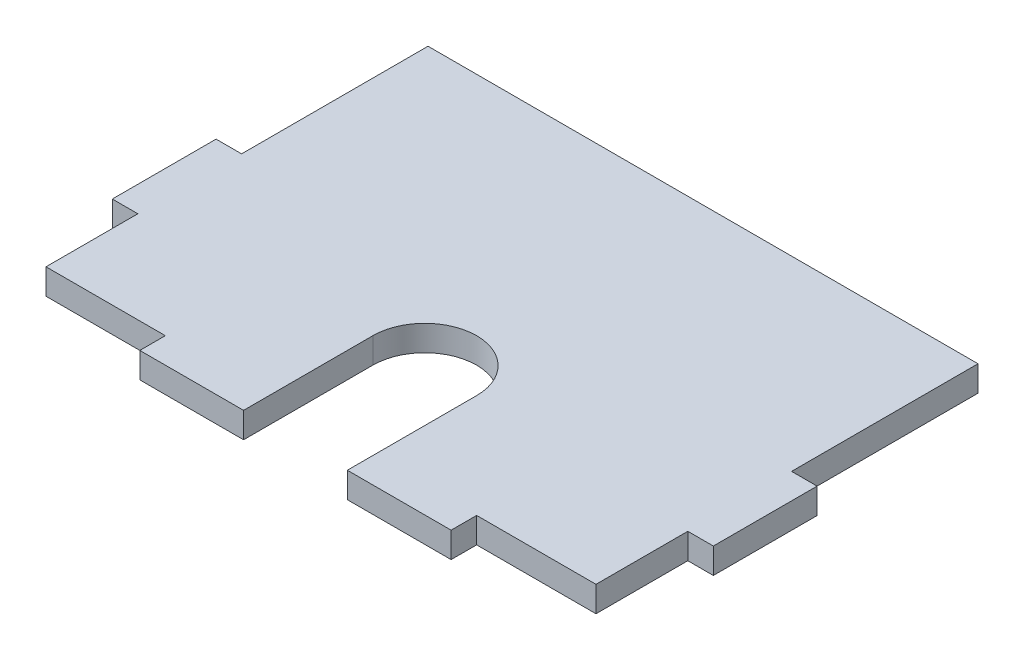
ISO-10303-21;
HEADER;
FILE_DESCRIPTION(('STEP AP214'),'2;1');
FILE_NAME('part.step','',(''),(''),'','','');
FILE_SCHEMA(('AUTOMOTIVE_DESIGN { 1 0 10303 214 1 1 1 1 }'));
ENDSEC;
DATA;
#1=APPLICATION_CONTEXT('core data for automotive mechanical design processes');
#2=APPLICATION_PROTOCOL_DEFINITION('international standard','automotive_design',2000,#1);
#3=PRODUCT_CONTEXT('',#1,'mechanical');
#4=PRODUCT('Part','Part','',(#3));
#5=PRODUCT_RELATED_PRODUCT_CATEGORY('part','',(#4));
#6=PRODUCT_DEFINITION_FORMATION('','',#4);
#7=PRODUCT_DEFINITION_CONTEXT('part definition',#1,'design');
#8=PRODUCT_DEFINITION('design','',#6,#7);
#9=PRODUCT_DEFINITION_SHAPE('','',#8);
#10=(LENGTH_UNIT() NAMED_UNIT(*) SI_UNIT(.MILLI.,.METRE.));
#11=(NAMED_UNIT(*) PLANE_ANGLE_UNIT() SI_UNIT($,.RADIAN.));
#12=(NAMED_UNIT(*) SI_UNIT($,.STERADIAN.) SOLID_ANGLE_UNIT());
#13=UNCERTAINTY_MEASURE_WITH_UNIT(LENGTH_MEASURE(1.E-05),#10,'distance_accuracy_value','');
#14=(GEOMETRIC_REPRESENTATION_CONTEXT(3) GLOBAL_UNCERTAINTY_ASSIGNED_CONTEXT((#13)) GLOBAL_UNIT_ASSIGNED_CONTEXT((#10,
#11,#12)) REPRESENTATION_CONTEXT('',''));
#15=CARTESIAN_POINT('',(0.,0.,0.));
#16=DIRECTION('',(0.,0.,1.));
#17=DIRECTION('',(1.,0.,0.));
#18=AXIS2_PLACEMENT_3D('',#15,#16,#17);
#19=CARTESIAN_POINT('',(133.35,3.1242,37.338));
#20=DIRECTION('',(0.,-1.,0.));
#21=DIRECTION('',(0.,0.,-1.));
#22=AXIS2_PLACEMENT_3D('',#19,#20,#21);
#23=CYLINDRICAL_SURFACE('',#22,6.34999999999997);
#24=CARTESIAN_POINT('',(133.35,0.,37.338));
#25=DIRECTION('',(0.,-1.,0.));
#26=DIRECTION('',(0.,0.,1.));
#27=AXIS2_PLACEMENT_3D('',#24,#25,#26);
#28=CIRCLE('',#27,6.34999999999997);
#29=CARTESIAN_POINT('',(127.,0.,37.338));
#30=VERTEX_POINT('',#29);
#31=CARTESIAN_POINT('',(139.7,0.,37.338));
#32=VERTEX_POINT('',#31);
#33=EDGE_CURVE('E205',#30,#32,#28,.T.);
#34=ORIENTED_EDGE('',*,*,#33,.T.);
#35=DIRECTION('',(0.,-1.,0.));
#36=VECTOR('',#35,1.);
#37=CARTESIAN_POINT('',(139.7,3.1242,37.338));
#38=LINE('',#37,#36);
#39=CARTESIAN_POINT('',(139.7,3.1242,37.338));
#40=VERTEX_POINT('',#39);
#41=EDGE_CURVE('E41',#40,#32,#38,.T.);
#42=ORIENTED_EDGE('',*,*,#41,.F.);
#43=CARTESIAN_POINT('',(133.35,3.1242,37.338));
#44=DIRECTION('',(0.,-1.,0.));
#45=DIRECTION('',(0.,0.,1.));
#46=AXIS2_PLACEMENT_3D('',#43,#44,#45);
#47=CIRCLE('',#46,6.34999999999997);
#48=CARTESIAN_POINT('',(127.,3.1242,37.338));
#49=VERTEX_POINT('',#48);
#50=EDGE_CURVE('E129',#49,#40,#47,.T.);
#51=ORIENTED_EDGE('',*,*,#50,.F.);
#52=DIRECTION('',(0.,-1.,0.));
#53=VECTOR('',#52,1.);
#54=CARTESIAN_POINT('',(127.,3.1242,37.338));
#55=LINE('',#54,#53);
#56=EDGE_CURVE('E11',#49,#30,#55,.T.);
#57=ORIENTED_EDGE('',*,*,#56,.T.);
#58=EDGE_LOOP('',(#34,#42,#51,#57));
#59=FACE_BOUND('',#58,.T.);
#60=ADVANCED_FACE('F33',(#59),#23,.F.);
#61=CARTESIAN_POINT('',(139.7,3.1242,50.038));
#62=DIRECTION('',(1.,0.,0.));
#63=DIRECTION('',(0.,0.,-1.));
#64=AXIS2_PLACEMENT_3D('',#61,#62,#63);
#65=PLANE('',#64);
#66=DIRECTION('',(0.,0.,1.));
#67=VECTOR('',#66,1.);
#68=CARTESIAN_POINT('',(139.7,0.,50.038));
#69=LINE('',#68,#67);
#70=CARTESIAN_POINT('',(139.7,0.,53.1622));
#71=VERTEX_POINT('',#70);
#72=EDGE_CURVE('E208',#32,#71,#69,.T.);
#73=ORIENTED_EDGE('',*,*,#72,.T.);
#74=DIRECTION('',(0.,-1.,0.));
#75=VECTOR('',#74,1.);
#76=CARTESIAN_POINT('',(139.7,3.1242,53.1622));
#77=LINE('',#76,#75);
#78=CARTESIAN_POINT('',(139.7,3.1242,53.1622));
#79=VERTEX_POINT('',#78);
#80=EDGE_CURVE('E285',#79,#71,#77,.T.);
#81=ORIENTED_EDGE('',*,*,#80,.F.);
#82=DIRECTION('',(0.,0.,1.));
#83=VECTOR('',#82,1.);
#84=CARTESIAN_POINT('',(139.7,3.1242,37.338));
#85=LINE('',#84,#83);
#86=EDGE_CURVE('E292',#40,#79,#85,.T.);
#87=ORIENTED_EDGE('',*,*,#86,.F.);
#88=ORIENTED_EDGE('',*,*,#41,.T.);
#89=EDGE_LOOP('',(#73,#81,#87,#88));
#90=FACE_BOUND('',#89,.T.);
#91=ADVANCED_FACE('F290',(#90),#65,.F.);
#92=CARTESIAN_POINT('',(139.7,3.1242,53.1622));
#93=DIRECTION('',(0.,0.,-1.));
#94=DIRECTION('',(-1.,0.,0.));
#95=AXIS2_PLACEMENT_3D('',#92,#93,#94);
#96=PLANE('',#95);
#97=DIRECTION('',(1.,0.,0.));
#98=VECTOR('',#97,1.);
#99=CARTESIAN_POINT('',(139.7,0.,53.1622));
#100=LINE('',#99,#98);
#101=CARTESIAN_POINT('',(152.4,0.,53.1622));
#102=VERTEX_POINT('',#101);
#103=EDGE_CURVE('E210',#71,#102,#100,.T.);
#104=ORIENTED_EDGE('',*,*,#103,.T.);
#105=DIRECTION('',(0.,-1.,0.));
#106=VECTOR('',#105,1.);
#107=CARTESIAN_POINT('',(152.4,3.1242,53.1622));
#108=LINE('',#107,#106);
#109=CARTESIAN_POINT('',(152.4,3.1242,53.1622));
#110=VERTEX_POINT('',#109);
#111=EDGE_CURVE('E282',#110,#102,#108,.T.);
#112=ORIENTED_EDGE('',*,*,#111,.F.);
#113=DIRECTION('',(1.,0.,0.));
#114=VECTOR('',#113,1.);
#115=CARTESIAN_POINT('',(139.7,3.1242,53.1622));
#116=LINE('',#115,#114);
#117=EDGE_CURVE('E311',#79,#110,#116,.T.);
#118=ORIENTED_EDGE('',*,*,#117,.F.);
#119=ORIENTED_EDGE('',*,*,#80,.T.);
#120=EDGE_LOOP('',(#104,#112,#118,#119));
#121=FACE_BOUND('',#120,.T.);
#122=ADVANCED_FACE('F302',(#121),#96,.F.);
#123=CARTESIAN_POINT('',(152.4,3.1242,53.1622));
#124=DIRECTION('',(-1.,0.,0.));
#125=DIRECTION('',(0.,0.,1.));
#126=AXIS2_PLACEMENT_3D('',#123,#124,#125);
#127=PLANE('',#126);
#128=DIRECTION('',(0.,0.,-1.));
#129=VECTOR('',#128,1.);
#130=CARTESIAN_POINT('',(152.4,0.,53.1622));
#131=LINE('',#130,#129);
#132=CARTESIAN_POINT('',(152.4,0.,50.038));
#133=VERTEX_POINT('',#132);
#134=EDGE_CURVE('E212',#102,#133,#131,.T.);
#135=ORIENTED_EDGE('',*,*,#134,.T.);
#136=DIRECTION('',(0.,-1.,0.));
#137=VECTOR('',#136,1.);
#138=CARTESIAN_POINT('',(152.4,3.1242,50.038));
#139=LINE('',#138,#137);
#140=CARTESIAN_POINT('',(152.4,3.1242,50.038));
#141=VERTEX_POINT('',#140);
#142=EDGE_CURVE('E279',#141,#133,#139,.T.);
#143=ORIENTED_EDGE('',*,*,#142,.F.);
#144=DIRECTION('',(0.,0.,-1.));
#145=VECTOR('',#144,1.);
#146=CARTESIAN_POINT('',(152.4,3.1242,53.1622));
#147=LINE('',#146,#145);
#148=EDGE_CURVE('E308',#110,#141,#147,.T.);
#149=ORIENTED_EDGE('',*,*,#148,.F.);
#150=ORIENTED_EDGE('',*,*,#111,.T.);
#151=EDGE_LOOP('',(#135,#143,#149,#150));
#152=FACE_BOUND('',#151,.T.);
#153=ADVANCED_FACE('F306',(#152),#127,.F.);
#154=CARTESIAN_POINT('',(152.4,3.1242,50.038));
#155=DIRECTION('',(0.,0.,-1.));
#156=DIRECTION('',(-1.,0.,0.));
#157=AXIS2_PLACEMENT_3D('',#154,#155,#156);
#158=PLANE('',#157);
#159=DIRECTION('',(1.,0.,0.));
#160=VECTOR('',#159,1.);
#161=CARTESIAN_POINT('',(152.4,0.,50.038));
#162=LINE('',#161,#160);
#163=CARTESIAN_POINT('',(167.005,0.,50.038));
#164=VERTEX_POINT('',#163);
#165=EDGE_CURVE('E214',#133,#164,#162,.T.);
#166=ORIENTED_EDGE('',*,*,#165,.T.);
#167=DIRECTION('',(0.,-1.,0.));
#168=VECTOR('',#167,1.);
#169=CARTESIAN_POINT('',(167.005,3.1242,50.038));
#170=LINE('',#169,#168);
#171=CARTESIAN_POINT('',(167.005,3.1242,50.038));
#172=VERTEX_POINT('',#171);
#173=EDGE_CURVE('E276',#172,#164,#170,.T.);
#174=ORIENTED_EDGE('',*,*,#173,.F.);
#175=DIRECTION('',(1.,0.,0.));
#176=VECTOR('',#175,1.);
#177=CARTESIAN_POINT('',(152.4,3.1242,50.038));
#178=LINE('',#177,#176);
#179=EDGE_CURVE('E310',#141,#172,#178,.T.);
#180=ORIENTED_EDGE('',*,*,#179,.F.);
#181=ORIENTED_EDGE('',*,*,#142,.T.);
#182=EDGE_LOOP('',(#166,#174,#180,#181));
#183=FACE_BOUND('',#182,.T.);
#184=ADVANCED_FACE('F391',(#183),#158,.F.);
#185=CARTESIAN_POINT('',(167.005,3.1242,50.038));
#186=DIRECTION('',(-1.,0.,0.));
#187=DIRECTION('',(0.,0.,1.));
#188=AXIS2_PLACEMENT_3D('',#185,#186,#187);
#189=PLANE('',#188);
#190=DIRECTION('',(0.,0.,-1.));
#191=VECTOR('',#190,1.);
#192=CARTESIAN_POINT('',(167.005,0.,50.038));
#193=LINE('',#192,#191);
#194=CARTESIAN_POINT('',(167.005,0.,38.7985));
#195=VERTEX_POINT('',#194);
#196=EDGE_CURVE('E216',#164,#195,#193,.T.);
#197=ORIENTED_EDGE('',*,*,#196,.T.);
#198=DIRECTION('',(0.,-1.,0.));
#199=VECTOR('',#198,1.);
#200=CARTESIAN_POINT('',(167.005,3.1242,38.7985));
#201=LINE('',#200,#199);
#202=CARTESIAN_POINT('',(167.005,3.1242,38.7985));
#203=VERTEX_POINT('',#202);
#204=EDGE_CURVE('E273',#203,#195,#201,.T.);
#205=ORIENTED_EDGE('',*,*,#204,.F.);
#206=DIRECTION('',(0.,0.,-1.));
#207=VECTOR('',#206,1.);
#208=CARTESIAN_POINT('',(167.005,3.1242,50.038));
#209=LINE('',#208,#207);
#210=EDGE_CURVE('E313',#172,#203,#209,.T.);
#211=ORIENTED_EDGE('',*,*,#210,.F.);
#212=ORIENTED_EDGE('',*,*,#173,.T.);
#213=EDGE_LOOP('',(#197,#205,#211,#212));
#214=FACE_BOUND('',#213,.T.);
#215=ADVANCED_FACE('F388',(#214),#189,.F.);
#216=CARTESIAN_POINT('',(167.005,3.1242,38.7985));
#217=DIRECTION('',(0.,0.,-1.));
#218=DIRECTION('',(-1.,0.,0.));
#219=AXIS2_PLACEMENT_3D('',#216,#217,#218);
#220=PLANE('',#219);
#221=DIRECTION('',(1.,0.,0.));
#222=VECTOR('',#221,1.);
#223=CARTESIAN_POINT('',(167.005,0.,38.7985));
#224=LINE('',#223,#222);
#225=CARTESIAN_POINT('',(170.1292,0.,38.7985));
#226=VERTEX_POINT('',#225);
#227=EDGE_CURVE('E218',#195,#226,#224,.T.);
#228=ORIENTED_EDGE('',*,*,#227,.T.);
#229=DIRECTION('',(0.,-1.,0.));
#230=VECTOR('',#229,1.);
#231=CARTESIAN_POINT('',(170.1292,3.1242,38.7985));
#232=LINE('',#231,#230);
#233=CARTESIAN_POINT('',(170.1292,3.1242,38.7985));
#234=VERTEX_POINT('',#233);
#235=EDGE_CURVE('E270',#234,#226,#232,.T.);
#236=ORIENTED_EDGE('',*,*,#235,.F.);
#237=DIRECTION('',(1.,0.,0.));
#238=VECTOR('',#237,1.);
#239=CARTESIAN_POINT('',(167.005,3.1242,38.7985));
#240=LINE('',#239,#238);
#241=EDGE_CURVE('E319',#203,#234,#240,.T.);
#242=ORIENTED_EDGE('',*,*,#241,.F.);
#243=ORIENTED_EDGE('',*,*,#204,.T.);
#244=EDGE_LOOP('',(#228,#236,#242,#243));
#245=FACE_BOUND('',#244,.T.);
#246=ADVANCED_FACE('F384',(#245),#220,.F.);
#247=CARTESIAN_POINT('',(170.1292,3.1242,38.7985));
#248=DIRECTION('',(-1.,0.,0.));
#249=DIRECTION('',(0.,0.,1.));
#250=AXIS2_PLACEMENT_3D('',#247,#248,#249);
#251=PLANE('',#250);
#252=DIRECTION('',(0.,0.,-1.));
#253=VECTOR('',#252,1.);
#254=CARTESIAN_POINT('',(170.1292,0.,38.7985));
#255=LINE('',#254,#253);
#256=CARTESIAN_POINT('',(170.1292,0.,26.0985));
#257=VERTEX_POINT('',#256);
#258=EDGE_CURVE('E220',#226,#257,#255,.T.);
#259=ORIENTED_EDGE('',*,*,#258,.T.);
#260=DIRECTION('',(0.,-1.,0.));
#261=VECTOR('',#260,1.);
#262=CARTESIAN_POINT('',(170.1292,3.1242,26.0985));
#263=LINE('',#262,#261);
#264=CARTESIAN_POINT('',(170.1292,3.1242,26.0985));
#265=VERTEX_POINT('',#264);
#266=EDGE_CURVE('E267',#265,#257,#263,.T.);
#267=ORIENTED_EDGE('',*,*,#266,.F.);
#268=DIRECTION('',(0.,0.,-1.));
#269=VECTOR('',#268,1.);
#270=CARTESIAN_POINT('',(170.1292,3.1242,38.7985));
#271=LINE('',#270,#269);
#272=EDGE_CURVE('E321',#234,#265,#271,.T.);
#273=ORIENTED_EDGE('',*,*,#272,.F.);
#274=ORIENTED_EDGE('',*,*,#235,.T.);
#275=EDGE_LOOP('',(#259,#267,#273,#274));
#276=FACE_BOUND('',#275,.T.);
#277=ADVANCED_FACE('F379',(#276),#251,.F.);
#278=CARTESIAN_POINT('',(170.1292,3.1242,26.0985));
#279=DIRECTION('',(0.,0.,1.));
#280=DIRECTION('',(1.,0.,0.));
#281=AXIS2_PLACEMENT_3D('',#278,#279,#280);
#282=PLANE('',#281);
#283=DIRECTION('',(-1.,0.,0.));
#284=VECTOR('',#283,1.);
#285=CARTESIAN_POINT('',(170.1292,0.,26.0985));
#286=LINE('',#285,#284);
#287=CARTESIAN_POINT('',(167.005,0.,26.0985));
#288=VERTEX_POINT('',#287);
#289=EDGE_CURVE('E222',#257,#288,#286,.T.);
#290=ORIENTED_EDGE('',*,*,#289,.T.);
#291=DIRECTION('',(0.,-1.,0.));
#292=VECTOR('',#291,1.);
#293=CARTESIAN_POINT('',(167.005,3.1242,26.0985));
#294=LINE('',#293,#292);
#295=CARTESIAN_POINT('',(167.005,3.1242,26.0985));
#296=VERTEX_POINT('',#295);
#297=EDGE_CURVE('E264',#296,#288,#294,.T.);
#298=ORIENTED_EDGE('',*,*,#297,.F.);
#299=DIRECTION('',(-1.,0.,0.));
#300=VECTOR('',#299,1.);
#301=CARTESIAN_POINT('',(170.1292,3.1242,26.0985));
#302=LINE('',#301,#300);
#303=EDGE_CURVE('E323',#265,#296,#302,.T.);
#304=ORIENTED_EDGE('',*,*,#303,.F.);
#305=ORIENTED_EDGE('',*,*,#266,.T.);
#306=EDGE_LOOP('',(#290,#298,#304,#305));
#307=FACE_BOUND('',#306,.T.);
#308=ADVANCED_FACE('F373',(#307),#282,.F.);
#309=CARTESIAN_POINT('',(167.005,3.1242,26.0985));
#310=DIRECTION('',(-1.,0.,0.));
#311=DIRECTION('',(0.,0.,1.));
#312=AXIS2_PLACEMENT_3D('',#309,#310,#311);
#313=PLANE('',#312);
#314=DIRECTION('',(0.,0.,-1.));
#315=VECTOR('',#314,1.);
#316=CARTESIAN_POINT('',(167.005,0.,26.0985));
#317=LINE('',#316,#315);
#318=CARTESIAN_POINT('',(167.005,0.,3.28263708266812));
#319=VERTEX_POINT('',#318);
#320=EDGE_CURVE('E224',#288,#319,#317,.T.);
#321=ORIENTED_EDGE('',*,*,#320,.T.);
#322=DIRECTION('',(0.,-1.,0.));
#323=VECTOR('',#322,1.);
#324=CARTESIAN_POINT('',(167.005,3.1242,3.28263708266812));
#325=LINE('',#324,#323);
#326=CARTESIAN_POINT('',(167.005,3.1242,3.28263708266812));
#327=VERTEX_POINT('',#326);
#328=EDGE_CURVE('E261',#327,#319,#325,.T.);
#329=ORIENTED_EDGE('',*,*,#328,.F.);
#330=DIRECTION('',(0.,0.,-1.));
#331=VECTOR('',#330,1.);
#332=CARTESIAN_POINT('',(167.005,3.1242,26.0985));
#333=LINE('',#332,#331);
#334=EDGE_CURVE('E325',#296,#327,#333,.T.);
#335=ORIENTED_EDGE('',*,*,#334,.F.);
#336=ORIENTED_EDGE('',*,*,#297,.T.);
#337=EDGE_LOOP('',(#321,#329,#335,#336));
#338=FACE_BOUND('',#337,.T.);
#339=ADVANCED_FACE('F369',(#338),#313,.F.);
#340=CARTESIAN_POINT('',(167.005,3.1242,3.28263708266812));
#341=DIRECTION('',(0.,0.,1.));
#342=DIRECTION('',(1.,0.,0.));
#343=AXIS2_PLACEMENT_3D('',#340,#341,#342);
#344=PLANE('',#343);
#345=DIRECTION('',(-1.,0.,0.));
#346=VECTOR('',#345,1.);
#347=CARTESIAN_POINT('',(167.005,0.,3.28263708266812));
#348=LINE('',#347,#346);
#349=CARTESIAN_POINT('',(99.695,0.,3.28263708266813));
#350=VERTEX_POINT('',#349);
#351=EDGE_CURVE('E226',#319,#350,#348,.T.);
#352=ORIENTED_EDGE('',*,*,#351,.T.);
#353=DIRECTION('',(0.,-1.,0.));
#354=VECTOR('',#353,1.);
#355=CARTESIAN_POINT('',(99.695,3.1242,3.28263708266813));
#356=LINE('',#355,#354);
#357=CARTESIAN_POINT('',(99.695,3.1242,3.28263708266813));
#358=VERTEX_POINT('',#357);
#359=EDGE_CURVE('E258',#358,#350,#356,.T.);
#360=ORIENTED_EDGE('',*,*,#359,.F.);
#361=DIRECTION('',(-1.,0.,0.));
#362=VECTOR('',#361,1.);
#363=CARTESIAN_POINT('',(167.005,3.1242,3.28263708266812));
#364=LINE('',#363,#362);
#365=EDGE_CURVE('E327',#327,#358,#364,.T.);
#366=ORIENTED_EDGE('',*,*,#365,.F.);
#367=ORIENTED_EDGE('',*,*,#328,.T.);
#368=EDGE_LOOP('',(#352,#360,#366,#367));
#369=FACE_BOUND('',#368,.T.);
#370=ADVANCED_FACE('F364',(#369),#344,.F.);
#371=CARTESIAN_POINT('',(99.695,3.1242,3.28263708266813));
#372=DIRECTION('',(1.,0.,0.));
#373=DIRECTION('',(0.,0.,-1.));
#374=AXIS2_PLACEMENT_3D('',#371,#372,#373);
#375=PLANE('',#374);
#376=DIRECTION('',(0.,0.,1.));
#377=VECTOR('',#376,1.);
#378=CARTESIAN_POINT('',(99.695,0.,3.28263708266813));
#379=LINE('',#378,#377);
#380=CARTESIAN_POINT('',(99.695,0.,26.0985));
#381=VERTEX_POINT('',#380);
#382=EDGE_CURVE('E228',#350,#381,#379,.T.);
#383=ORIENTED_EDGE('',*,*,#382,.T.);
#384=DIRECTION('',(0.,-1.,0.));
#385=VECTOR('',#384,1.);
#386=CARTESIAN_POINT('',(99.695,3.1242,26.0985));
#387=LINE('',#386,#385);
#388=CARTESIAN_POINT('',(99.695,3.1242,26.0985));
#389=VERTEX_POINT('',#388);
#390=EDGE_CURVE('E255',#389,#381,#387,.T.);
#391=ORIENTED_EDGE('',*,*,#390,.F.);
#392=DIRECTION('',(0.,0.,1.));
#393=VECTOR('',#392,1.);
#394=CARTESIAN_POINT('',(99.695,3.1242,3.28263708266813));
#395=LINE('',#394,#393);
#396=EDGE_CURVE('E329',#358,#389,#395,.T.);
#397=ORIENTED_EDGE('',*,*,#396,.F.);
#398=ORIENTED_EDGE('',*,*,#359,.T.);
#399=EDGE_LOOP('',(#383,#391,#397,#398));
#400=FACE_BOUND('',#399,.T.);
#401=ADVANCED_FACE('F358',(#400),#375,.F.);
#402=CARTESIAN_POINT('',(99.695,3.1242,26.0985));
#403=DIRECTION('',(0.,0.,1.));
#404=DIRECTION('',(1.,0.,0.));
#405=AXIS2_PLACEMENT_3D('',#402,#403,#404);
#406=PLANE('',#405);
#407=DIRECTION('',(-1.,0.,0.));
#408=VECTOR('',#407,1.);
#409=CARTESIAN_POINT('',(99.695,0.,26.0985));
#410=LINE('',#409,#408);
#411=CARTESIAN_POINT('',(96.5708,0.,26.0985));
#412=VERTEX_POINT('',#411);
#413=EDGE_CURVE('E230',#381,#412,#410,.T.);
#414=ORIENTED_EDGE('',*,*,#413,.T.);
#415=DIRECTION('',(0.,-1.,0.));
#416=VECTOR('',#415,1.);
#417=CARTESIAN_POINT('',(96.5708,3.1242,26.0985));
#418=LINE('',#417,#416);
#419=CARTESIAN_POINT('',(96.5708,3.1242,26.0985));
#420=VERTEX_POINT('',#419);
#421=EDGE_CURVE('E252',#420,#412,#418,.T.);
#422=ORIENTED_EDGE('',*,*,#421,.F.);
#423=DIRECTION('',(-1.,0.,0.));
#424=VECTOR('',#423,1.);
#425=CARTESIAN_POINT('',(99.695,3.1242,26.0985));
#426=LINE('',#425,#424);
#427=EDGE_CURVE('E331',#389,#420,#426,.T.);
#428=ORIENTED_EDGE('',*,*,#427,.F.);
#429=ORIENTED_EDGE('',*,*,#390,.T.);
#430=EDGE_LOOP('',(#414,#422,#428,#429));
#431=FACE_BOUND('',#430,.T.);
#432=ADVANCED_FACE('F354',(#431),#406,.F.);
#433=CARTESIAN_POINT('',(96.5708,3.1242,26.0985));
#434=DIRECTION('',(1.,0.,0.));
#435=DIRECTION('',(0.,0.,-1.));
#436=AXIS2_PLACEMENT_3D('',#433,#434,#435);
#437=PLANE('',#436);
#438=DIRECTION('',(0.,0.,1.));
#439=VECTOR('',#438,1.);
#440=CARTESIAN_POINT('',(96.5708,0.,26.0985));
#441=LINE('',#440,#439);
#442=CARTESIAN_POINT('',(96.5708,0.,38.7985));
#443=VERTEX_POINT('',#442);
#444=EDGE_CURVE('E232',#412,#443,#441,.T.);
#445=ORIENTED_EDGE('',*,*,#444,.T.);
#446=DIRECTION('',(0.,-1.,0.));
#447=VECTOR('',#446,1.);
#448=CARTESIAN_POINT('',(96.5708,3.1242,38.7985));
#449=LINE('',#448,#447);
#450=CARTESIAN_POINT('',(96.5708,3.1242,38.7985));
#451=VERTEX_POINT('',#450);
#452=EDGE_CURVE('E249',#451,#443,#449,.T.);
#453=ORIENTED_EDGE('',*,*,#452,.F.);
#454=DIRECTION('',(0.,0.,1.));
#455=VECTOR('',#454,1.);
#456=CARTESIAN_POINT('',(96.5708,3.1242,26.0985));
#457=LINE('',#456,#455);
#458=EDGE_CURVE('E333',#420,#451,#457,.T.);
#459=ORIENTED_EDGE('',*,*,#458,.F.);
#460=ORIENTED_EDGE('',*,*,#421,.T.);
#461=EDGE_LOOP('',(#445,#453,#459,#460));
#462=FACE_BOUND('',#461,.T.);
#463=ADVANCED_FACE('F350',(#462),#437,.F.);
#464=CARTESIAN_POINT('',(96.5708,3.1242,38.7985));
#465=DIRECTION('',(0.,0.,-1.));
#466=DIRECTION('',(-1.,0.,0.));
#467=AXIS2_PLACEMENT_3D('',#464,#465,#466);
#468=PLANE('',#467);
#469=DIRECTION('',(1.,0.,0.));
#470=VECTOR('',#469,1.);
#471=CARTESIAN_POINT('',(96.5708,0.,38.7985));
#472=LINE('',#471,#470);
#473=CARTESIAN_POINT('',(99.695,0.,38.7985));
#474=VERTEX_POINT('',#473);
#475=EDGE_CURVE('E234',#443,#474,#472,.T.);
#476=ORIENTED_EDGE('',*,*,#475,.T.);
#477=DIRECTION('',(0.,-1.,0.));
#478=VECTOR('',#477,1.);
#479=CARTESIAN_POINT('',(99.695,3.1242,38.7985));
#480=LINE('',#479,#478);
#481=CARTESIAN_POINT('',(99.695,3.1242,38.7985));
#482=VERTEX_POINT('',#481);
#483=EDGE_CURVE('E246',#482,#474,#480,.T.);
#484=ORIENTED_EDGE('',*,*,#483,.F.);
#485=DIRECTION('',(1.,0.,0.));
#486=VECTOR('',#485,1.);
#487=CARTESIAN_POINT('',(96.5708,3.1242,38.7985));
#488=LINE('',#487,#486);
#489=EDGE_CURVE('E335',#451,#482,#488,.T.);
#490=ORIENTED_EDGE('',*,*,#489,.F.);
#491=ORIENTED_EDGE('',*,*,#452,.T.);
#492=EDGE_LOOP('',(#476,#484,#490,#491));
#493=FACE_BOUND('',#492,.T.);
#494=ADVANCED_FACE('F341',(#493),#468,.F.);
#495=CARTESIAN_POINT('',(99.695,3.1242,38.7985));
#496=DIRECTION('',(1.,0.,0.));
#497=DIRECTION('',(0.,0.,-1.));
#498=AXIS2_PLACEMENT_3D('',#495,#496,#497);
#499=PLANE('',#498);
#500=DIRECTION('',(0.,0.,1.));
#501=VECTOR('',#500,1.);
#502=CARTESIAN_POINT('',(99.695,0.,38.7985));
#503=LINE('',#502,#501);
#504=CARTESIAN_POINT('',(99.695,0.,50.038));
#505=VERTEX_POINT('',#504);
#506=EDGE_CURVE('E236',#474,#505,#503,.T.);
#507=ORIENTED_EDGE('',*,*,#506,.T.);
#508=DIRECTION('',(0.,-1.,0.));
#509=VECTOR('',#508,1.);
#510=CARTESIAN_POINT('',(99.695,3.1242,50.038));
#511=LINE('',#510,#509);
#512=CARTESIAN_POINT('',(99.695,3.1242,50.038));
#513=VERTEX_POINT('',#512);
#514=EDGE_CURVE('E194',#513,#505,#511,.T.);
#515=ORIENTED_EDGE('',*,*,#514,.F.);
#516=DIRECTION('',(0.,0.,1.));
#517=VECTOR('',#516,1.);
#518=CARTESIAN_POINT('',(99.695,3.1242,38.7985));
#519=LINE('',#518,#517);
#520=EDGE_CURVE('E185',#482,#513,#519,.T.);
#521=ORIENTED_EDGE('',*,*,#520,.F.);
#522=ORIENTED_EDGE('',*,*,#483,.T.);
#523=EDGE_LOOP('',(#507,#515,#521,#522));
#524=FACE_BOUND('',#523,.T.);
#525=ADVANCED_FACE('F345',(#524),#499,.F.);
#526=CARTESIAN_POINT('',(99.695,3.1242,50.038));
#527=DIRECTION('',(0.,0.,-1.));
#528=DIRECTION('',(-1.,0.,0.));
#529=AXIS2_PLACEMENT_3D('',#526,#527,#528);
#530=PLANE('',#529);
#531=DIRECTION('',(1.,0.,0.));
#532=VECTOR('',#531,1.);
#533=CARTESIAN_POINT('',(99.695,0.,50.038));
#534=LINE('',#533,#532);
#535=CARTESIAN_POINT('',(114.3,0.,50.038));
#536=VERTEX_POINT('',#535);
#537=EDGE_CURVE('E193',#505,#536,#534,.T.);
#538=ORIENTED_EDGE('',*,*,#537,.T.);
#539=DIRECTION('',(0.,-1.,0.));
#540=VECTOR('',#539,1.);
#541=CARTESIAN_POINT('',(114.3,3.1242,50.038));
#542=LINE('',#541,#540);
#543=CARTESIAN_POINT('',(114.3,3.1242,50.038));
#544=VERTEX_POINT('',#543);
#545=EDGE_CURVE('E190',#544,#536,#542,.T.);
#546=ORIENTED_EDGE('',*,*,#545,.F.);
#547=DIRECTION('',(1.,0.,0.));
#548=VECTOR('',#547,1.);
#549=CARTESIAN_POINT('',(99.695,3.1242,50.038));
#550=LINE('',#549,#548);
#551=EDGE_CURVE('E179',#513,#544,#550,.T.);
#552=ORIENTED_EDGE('',*,*,#551,.F.);
#553=ORIENTED_EDGE('',*,*,#514,.T.);
#554=EDGE_LOOP('',(#538,#546,#552,#553));
#555=FACE_BOUND('',#554,.T.);
#556=ADVANCED_FACE('F191',(#555),#530,.F.);
#557=CARTESIAN_POINT('',(114.3,3.1242,50.038));
#558=DIRECTION('',(1.,0.,0.));
#559=DIRECTION('',(0.,0.,-1.));
#560=AXIS2_PLACEMENT_3D('',#557,#558,#559);
#561=PLANE('',#560);
#562=DIRECTION('',(0.,0.,1.));
#563=VECTOR('',#562,1.);
#564=CARTESIAN_POINT('',(114.3,0.,50.038));
#565=LINE('',#564,#563);
#566=CARTESIAN_POINT('',(114.3,0.,53.1622));
#567=VERTEX_POINT('',#566);
#568=EDGE_CURVE('E115',#536,#567,#565,.T.);
#569=ORIENTED_EDGE('',*,*,#568,.T.);
#570=DIRECTION('',(0.,-1.,0.));
#571=VECTOR('',#570,1.);
#572=CARTESIAN_POINT('',(114.3,3.1242,53.1622));
#573=LINE('',#572,#571);
#574=CARTESIAN_POINT('',(114.3,3.1242,53.1622));
#575=VERTEX_POINT('',#574);
#576=EDGE_CURVE('E195',#575,#567,#573,.T.);
#577=ORIENTED_EDGE('',*,*,#576,.F.);
#578=DIRECTION('',(0.,0.,1.));
#579=VECTOR('',#578,1.);
#580=CARTESIAN_POINT('',(114.3,3.1242,50.038));
#581=LINE('',#580,#579);
#582=EDGE_CURVE('E183',#544,#575,#581,.T.);
#583=ORIENTED_EDGE('',*,*,#582,.F.);
#584=ORIENTED_EDGE('',*,*,#545,.T.);
#585=EDGE_LOOP('',(#569,#577,#583,#584));
#586=FACE_BOUND('',#585,.T.);
#587=ADVANCED_FACE('F197',(#586),#561,.F.);
#588=CARTESIAN_POINT('',(114.3,3.1242,53.1622));
#589=DIRECTION('',(0.,0.,-1.));
#590=DIRECTION('',(-1.,0.,0.));
#591=AXIS2_PLACEMENT_3D('',#588,#589,#590);
#592=PLANE('',#591);
#593=DIRECTION('',(1.,0.,0.));
#594=VECTOR('',#593,1.);
#595=CARTESIAN_POINT('',(114.3,0.,53.1622));
#596=LINE('',#595,#594);
#597=CARTESIAN_POINT('',(127.,0.,53.1622));
#598=VERTEX_POINT('',#597);
#599=EDGE_CURVE('E122',#567,#598,#596,.T.);
#600=ORIENTED_EDGE('',*,*,#599,.T.);
#601=DIRECTION('',(0.,-1.,0.));
#602=VECTOR('',#601,1.);
#603=CARTESIAN_POINT('',(127.,3.1242,53.1622));
#604=LINE('',#603,#602);
#605=CARTESIAN_POINT('',(127.,3.1242,53.1622));
#606=VERTEX_POINT('',#605);
#607=EDGE_CURVE('E201',#606,#598,#604,.T.);
#608=ORIENTED_EDGE('',*,*,#607,.F.);
#609=DIRECTION('',(1.,0.,0.));
#610=VECTOR('',#609,1.);
#611=CARTESIAN_POINT('',(114.3,3.1242,53.1622));
#612=LINE('',#611,#610);
#613=EDGE_CURVE('E199',#575,#606,#612,.T.);
#614=ORIENTED_EDGE('',*,*,#613,.F.);
#615=ORIENTED_EDGE('',*,*,#576,.T.);
#616=EDGE_LOOP('',(#600,#608,#614,#615));
#617=FACE_BOUND('',#616,.T.);
#618=ADVANCED_FACE('F524',(#617),#592,.F.);
#619=CARTESIAN_POINT('',(127.,3.1242,53.1622));
#620=DIRECTION('',(-1.,0.,0.));
#621=DIRECTION('',(0.,0.,1.));
#622=AXIS2_PLACEMENT_3D('',#619,#620,#621);
#623=PLANE('',#622);
#624=DIRECTION('',(0.,0.,-1.));
#625=VECTOR('',#624,1.);
#626=CARTESIAN_POINT('',(127.,0.,53.1622));
#627=LINE('',#626,#625);
#628=EDGE_CURVE('E241',#598,#30,#627,.T.);
#629=ORIENTED_EDGE('',*,*,#628,.T.);
#630=ORIENTED_EDGE('',*,*,#56,.F.);
#631=DIRECTION('',(0.,0.,-1.));
#632=VECTOR('',#631,1.);
#633=CARTESIAN_POINT('',(127.,3.1242,50.038));
#634=LINE('',#633,#632);
#635=EDGE_CURVE('E49',#606,#49,#634,.T.);
#636=ORIENTED_EDGE('',*,*,#635,.F.);
#637=ORIENTED_EDGE('',*,*,#607,.T.);
#638=EDGE_LOOP('',(#629,#630,#636,#637));
#639=FACE_BOUND('',#638,.T.);
#640=ADVANCED_FACE('F533',(#639),#623,.F.);
#641=CARTESIAN_POINT('',(133.35,3.1242,37.338));
#642=DIRECTION('',(0.,1.,0.));
#643=DIRECTION('',(0.,0.,1.));
#644=AXIS2_PLACEMENT_3D('',#641,#642,#643);
#645=PLANE('',#644);
#646=ORIENTED_EDGE('',*,*,#635,.T.);
#647=ORIENTED_EDGE('',*,*,#50,.T.);
#648=ORIENTED_EDGE('',*,*,#86,.T.);
#649=ORIENTED_EDGE('',*,*,#117,.T.);
#650=ORIENTED_EDGE('',*,*,#148,.T.);
#651=ORIENTED_EDGE('',*,*,#179,.T.);
#652=ORIENTED_EDGE('',*,*,#210,.T.);
#653=ORIENTED_EDGE('',*,*,#241,.T.);
#654=ORIENTED_EDGE('',*,*,#272,.T.);
#655=ORIENTED_EDGE('',*,*,#303,.T.);
#656=ORIENTED_EDGE('',*,*,#334,.T.);
#657=ORIENTED_EDGE('',*,*,#365,.T.);
#658=ORIENTED_EDGE('',*,*,#396,.T.);
#659=ORIENTED_EDGE('',*,*,#427,.T.);
#660=ORIENTED_EDGE('',*,*,#458,.T.);
#661=ORIENTED_EDGE('',*,*,#489,.T.);
#662=ORIENTED_EDGE('',*,*,#520,.T.);
#663=ORIENTED_EDGE('',*,*,#551,.T.);
#664=ORIENTED_EDGE('',*,*,#582,.T.);
#665=ORIENTED_EDGE('',*,*,#613,.T.);
#666=EDGE_LOOP('',(#646,#647,#648,#649,#650,#651,#652,#653,#654,#655,#656,#657,#658,#659,#660,
#661,#662,#663,#664,#665));
#667=FACE_BOUND('',#666,.T.);
#668=ADVANCED_FACE('F181',(#667),#645,.T.);
#669=CARTESIAN_POINT('',(133.35,0.,37.338));
#670=DIRECTION('',(0.,1.,0.));
#671=DIRECTION('',(0.,0.,1.));
#672=AXIS2_PLACEMENT_3D('',#669,#670,#671);
#673=PLANE('',#672);
#674=ORIENTED_EDGE('',*,*,#33,.F.);
#675=ORIENTED_EDGE('',*,*,#628,.F.);
#676=ORIENTED_EDGE('',*,*,#599,.F.);
#677=ORIENTED_EDGE('',*,*,#568,.F.);
#678=ORIENTED_EDGE('',*,*,#537,.F.);
#679=ORIENTED_EDGE('',*,*,#506,.F.);
#680=ORIENTED_EDGE('',*,*,#475,.F.);
#681=ORIENTED_EDGE('',*,*,#444,.F.);
#682=ORIENTED_EDGE('',*,*,#413,.F.);
#683=ORIENTED_EDGE('',*,*,#382,.F.);
#684=ORIENTED_EDGE('',*,*,#351,.F.);
#685=ORIENTED_EDGE('',*,*,#320,.F.);
#686=ORIENTED_EDGE('',*,*,#289,.F.);
#687=ORIENTED_EDGE('',*,*,#258,.F.);
#688=ORIENTED_EDGE('',*,*,#227,.F.);
#689=ORIENTED_EDGE('',*,*,#196,.F.);
#690=ORIENTED_EDGE('',*,*,#165,.F.);
#691=ORIENTED_EDGE('',*,*,#134,.F.);
#692=ORIENTED_EDGE('',*,*,#103,.F.);
#693=ORIENTED_EDGE('',*,*,#72,.F.);
#694=EDGE_LOOP('',(#674,#675,#676,#677,#678,#679,#680,#681,#682,#683,#684,#685,#686,#687,#688,
#689,#690,#691,#692,#693));
#695=FACE_BOUND('',#694,.T.);
#696=ADVANCED_FACE('F296',(#695),#673,.F.);
#697=CLOSED_SHELL('',(#60,#91,#122,#153,#184,#215,#246,#277,#308,#339,#370,#401,#432,#463,#494,
#525,#556,#587,#618,#640,#668,#696));
#698=MANIFOLD_SOLID_BREP('B2',#697);
#699=ADVANCED_BREP_SHAPE_REPRESENTATION('',(#18,#698),#14);
#700=SHAPE_DEFINITION_REPRESENTATION(#9,#699);
ENDSEC;
END-ISO-10303-21;
